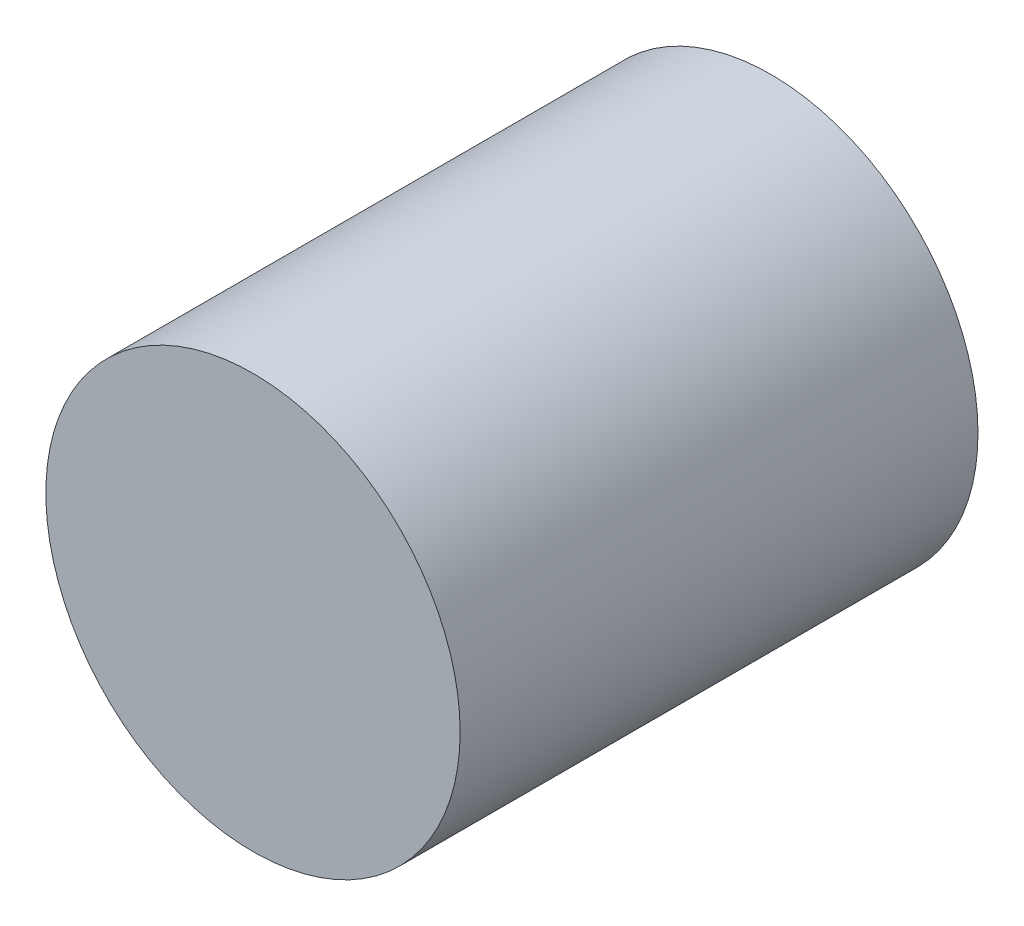
ISO-10303-21;
HEADER;
FILE_DESCRIPTION(('STEP AP214'),'2;1');
FILE_NAME('part.step','',(''),(''),'','','');
FILE_SCHEMA(('AUTOMOTIVE_DESIGN { 1 0 10303 214 1 1 1 1 }'));
ENDSEC;
DATA;
#1=APPLICATION_CONTEXT('core data for automotive mechanical design processes');
#2=APPLICATION_PROTOCOL_DEFINITION('international standard','automotive_design',2000,#1);
#3=PRODUCT_CONTEXT('',#1,'mechanical');
#4=PRODUCT('Part','Part','',(#3));
#5=PRODUCT_RELATED_PRODUCT_CATEGORY('part','',(#4));
#6=PRODUCT_DEFINITION_FORMATION('','',#4);
#7=PRODUCT_DEFINITION_CONTEXT('part definition',#1,'design');
#8=PRODUCT_DEFINITION('design','',#6,#7);
#9=PRODUCT_DEFINITION_SHAPE('','',#8);
#10=(LENGTH_UNIT() NAMED_UNIT(*) SI_UNIT(.MILLI.,.METRE.));
#11=(NAMED_UNIT(*) PLANE_ANGLE_UNIT() SI_UNIT($,.RADIAN.));
#12=(NAMED_UNIT(*) SI_UNIT($,.STERADIAN.) SOLID_ANGLE_UNIT());
#13=UNCERTAINTY_MEASURE_WITH_UNIT(LENGTH_MEASURE(1.E-05),#10,'distance_accuracy_value','');
#14=(GEOMETRIC_REPRESENTATION_CONTEXT(3) GLOBAL_UNCERTAINTY_ASSIGNED_CONTEXT((#13)) GLOBAL_UNIT_ASSIGNED_CONTEXT((#10,
#11,#12)) REPRESENTATION_CONTEXT('',''));
#15=CARTESIAN_POINT('',(0.,0.,0.));
#16=DIRECTION('',(0.,0.,1.));
#17=DIRECTION('',(1.,0.,0.));
#18=AXIS2_PLACEMENT_3D('',#15,#16,#17);
#19=CARTESIAN_POINT('',(0.,0.,5.));
#20=DIRECTION('',(0.,0.,-1.));
#21=DIRECTION('',(-1.,0.,0.));
#22=AXIS2_PLACEMENT_3D('',#19,#20,#21);
#23=CYLINDRICAL_SURFACE('',#22,2.);
#24=CARTESIAN_POINT('',(0.,0.,5.));
#25=DIRECTION('',(0.,0.,1.));
#26=DIRECTION('',(1.,0.,0.));
#27=AXIS2_PLACEMENT_3D('',#24,#25,#26);
#28=CIRCLE('',#27,2.);
#29=CARTESIAN_POINT('',(2.,0.,5.));
#30=VERTEX_POINT('',#29);
#31=EDGE_CURVE('E10',#30,#30,#28,.T.);
#32=ORIENTED_EDGE('',*,*,#31,.F.);
#33=EDGE_LOOP('',(#32));
#34=FACE_BOUND('',#33,.T.);
#35=CARTESIAN_POINT('',(0.,0.,0.));
#36=DIRECTION('',(0.,0.,1.));
#37=DIRECTION('',(1.,0.,0.));
#38=AXIS2_PLACEMENT_3D('',#35,#36,#37);
#39=CIRCLE('',#38,2.);
#40=CARTESIAN_POINT('',(2.,0.,0.));
#41=VERTEX_POINT('',#40);
#42=EDGE_CURVE('E34',#41,#41,#39,.T.);
#43=ORIENTED_EDGE('',*,*,#42,.T.);
#44=EDGE_LOOP('',(#43));
#45=FACE_BOUND('',#44,.T.);
#46=ADVANCED_FACE('F31',(#34,#45),#23,.T.);
#47=CARTESIAN_POINT('',(0.,0.,5.));
#48=DIRECTION('',(0.,0.,1.));
#49=DIRECTION('',(1.,0.,0.));
#50=AXIS2_PLACEMENT_3D('',#47,#48,#49);
#51=PLANE('',#50);
#52=ORIENTED_EDGE('',*,*,#31,.T.);
#53=EDGE_LOOP('',(#52));
#54=FACE_BOUND('',#53,.T.);
#55=ADVANCED_FACE('F46',(#54),#51,.T.);
#56=CARTESIAN_POINT('',(0.,0.,0.));
#57=DIRECTION('',(0.,0.,1.));
#58=DIRECTION('',(1.,0.,0.));
#59=AXIS2_PLACEMENT_3D('',#56,#57,#58);
#60=PLANE('',#59);
#61=ORIENTED_EDGE('',*,*,#42,.F.);
#62=EDGE_LOOP('',(#61));
#63=FACE_BOUND('',#62,.T.);
#64=ADVANCED_FACE('F44',(#63),#60,.F.);
#65=CLOSED_SHELL('',(#46,#55,#64));
#66=MANIFOLD_SOLID_BREP('B2',#65);
#67=ADVANCED_BREP_SHAPE_REPRESENTATION('',(#18,#66),#14);
#68=SHAPE_DEFINITION_REPRESENTATION(#9,#67);
ENDSEC;
END-ISO-10303-21;
